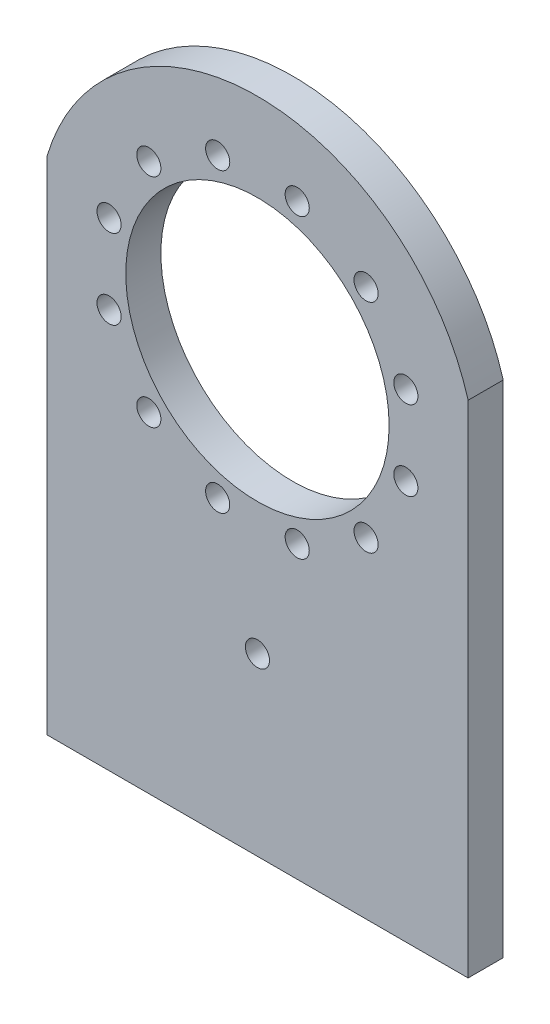
ISO-10303-21;
HEADER;
FILE_DESCRIPTION(('STEP AP214'),'2;1');
FILE_NAME('part.step','',(''),(''),'','','');
FILE_SCHEMA(('AUTOMOTIVE_DESIGN { 1 0 10303 214 1 1 1 1 }'));
ENDSEC;
DATA;
#1=APPLICATION_CONTEXT('core data for automotive mechanical design processes');
#2=APPLICATION_PROTOCOL_DEFINITION('international standard','automotive_design',2000,#1);
#3=PRODUCT_CONTEXT('',#1,'mechanical');
#4=PRODUCT('Part','Part','',(#3));
#5=PRODUCT_RELATED_PRODUCT_CATEGORY('part','',(#4));
#6=PRODUCT_DEFINITION_FORMATION('','',#4);
#7=PRODUCT_DEFINITION_CONTEXT('part definition',#1,'design');
#8=PRODUCT_DEFINITION('design','',#6,#7);
#9=PRODUCT_DEFINITION_SHAPE('','',#8);
#10=(LENGTH_UNIT() NAMED_UNIT(*) SI_UNIT(.MILLI.,.METRE.));
#11=(NAMED_UNIT(*) PLANE_ANGLE_UNIT() SI_UNIT($,.RADIAN.));
#12=(NAMED_UNIT(*) SI_UNIT($,.STERADIAN.) SOLID_ANGLE_UNIT());
#13=UNCERTAINTY_MEASURE_WITH_UNIT(LENGTH_MEASURE(1.E-05),#10,'distance_accuracy_value','');
#14=(GEOMETRIC_REPRESENTATION_CONTEXT(3) GLOBAL_UNCERTAINTY_ASSIGNED_CONTEXT((#13)) GLOBAL_UNIT_ASSIGNED_CONTEXT((#10,
#11,#12)) REPRESENTATION_CONTEXT('',''));
#15=CARTESIAN_POINT('',(0.,0.,0.));
#16=DIRECTION('',(0.,0.,1.));
#17=DIRECTION('',(1.,0.,0.));
#18=AXIS2_PLACEMENT_3D('',#15,#16,#17);
#19=CARTESIAN_POINT('',(0.,100.,8.));
#20=DIRECTION('',(0.,0.,1.));
#21=DIRECTION('',(1.,0.,0.));
#22=AXIS2_PLACEMENT_3D('',#19,#20,#21);
#23=PLANE('',#22);
#24=CARTESIAN_POINT('',(24.7487373415295,124.74873734153,8.));
#25=DIRECTION('',(0.,0.,1.));
#26=DIRECTION('',(1.,0.,0.));
#27=AXIS2_PLACEMENT_3D('',#24,#25,#26);
#28=CIRCLE('',#27,2.75);
#29=CARTESIAN_POINT('',(27.4987373415295,124.74873734153,8.));
#30=VERTEX_POINT('',#29);
#31=EDGE_CURVE('E424',#30,#30,#28,.T.);
#32=ORIENTED_EDGE('',*,*,#31,.F.);
#33=EDGE_LOOP('',(#32));
#34=FACE_BOUND('',#33,.T.);
#35=CARTESIAN_POINT('',(33.8074039201181,109.058666578589,8.));
#36=DIRECTION('',(0.,0.,1.));
#37=DIRECTION('',(1.,0.,0.));
#38=AXIS2_PLACEMENT_3D('',#35,#36,#37);
#39=CIRCLE('',#38,2.75);
#40=CARTESIAN_POINT('',(36.5574039201181,109.058666578589,8.));
#41=VERTEX_POINT('',#40);
#42=EDGE_CURVE('E425',#41,#41,#39,.T.);
#43=ORIENTED_EDGE('',*,*,#42,.F.);
#44=EDGE_LOOP('',(#43));
#45=FACE_BOUND('',#44,.T.);
#46=CARTESIAN_POINT('',(33.8074039201186,90.9413334214123,8.));
#47=DIRECTION('',(0.,0.,1.));
#48=DIRECTION('',(1.,0.,0.));
#49=AXIS2_PLACEMENT_3D('',#46,#47,#48);
#50=CIRCLE('',#49,2.75);
#51=CARTESIAN_POINT('',(36.5574039201186,90.9413334214123,8.));
#52=VERTEX_POINT('',#51);
#53=EDGE_CURVE('E429',#52,#52,#50,.T.);
#54=ORIENTED_EDGE('',*,*,#53,.F.);
#55=EDGE_LOOP('',(#54));
#56=FACE_BOUND('',#55,.T.);
#57=CARTESIAN_POINT('',(24.7487373415307,75.2512626584711,8.));
#58=DIRECTION('',(0.,0.,1.));
#59=DIRECTION('',(1.,0.,0.));
#60=AXIS2_PLACEMENT_3D('',#57,#58,#59);
#61=CIRCLE('',#60,2.74999999999999);
#62=CARTESIAN_POINT('',(27.4987373415307,75.2512626584711,8.));
#63=VERTEX_POINT('',#62);
#64=EDGE_CURVE('E437',#63,#63,#61,.T.);
#65=ORIENTED_EDGE('',*,*,#64,.F.);
#66=EDGE_LOOP('',(#65));
#67=FACE_BOUND('',#66,.T.);
#68=CARTESIAN_POINT('',(9.05866657858986,66.1925960798825,8.));
#69=DIRECTION('',(0.,0.,1.));
#70=DIRECTION('',(1.,0.,0.));
#71=AXIS2_PLACEMENT_3D('',#68,#69,#70);
#72=CIRCLE('',#71,2.74999999999999);
#73=CARTESIAN_POINT('',(11.8086665785899,66.1925960798825,8.));
#74=VERTEX_POINT('',#73);
#75=EDGE_CURVE('E440',#74,#74,#72,.T.);
#76=ORIENTED_EDGE('',*,*,#75,.F.);
#77=EDGE_LOOP('',(#76));
#78=FACE_BOUND('',#77,.T.);
#79=CARTESIAN_POINT('',(-9.05866657858664,66.1925960798821,8.));
#80=DIRECTION('',(0.,0.,1.));
#81=DIRECTION('',(1.,0.,0.));
#82=AXIS2_PLACEMENT_3D('',#79,#80,#81);
#83=CIRCLE('',#82,2.75);
#84=CARTESIAN_POINT('',(-6.30866657858664,66.1925960798821,8.));
#85=VERTEX_POINT('',#84);
#86=EDGE_CURVE('E443',#85,#85,#83,.T.);
#87=ORIENTED_EDGE('',*,*,#86,.F.);
#88=EDGE_LOOP('',(#87));
#89=FACE_BOUND('',#88,.T.);
#90=CARTESIAN_POINT('',(-24.7487373415278,75.2512626584701,8.));
#91=DIRECTION('',(0.,0.,1.));
#92=DIRECTION('',(1.,0.,0.));
#93=AXIS2_PLACEMENT_3D('',#90,#91,#92);
#94=CIRCLE('',#93,2.75);
#95=CARTESIAN_POINT('',(-21.9987373415278,75.2512626584701,8.));
#96=VERTEX_POINT('',#95);
#97=EDGE_CURVE('E446',#96,#96,#94,.T.);
#98=ORIENTED_EDGE('',*,*,#97,.F.);
#99=EDGE_LOOP('',(#98));
#100=FACE_BOUND('',#99,.T.);
#101=CARTESIAN_POINT('',(-33.8074039201163,90.9413334214109,8.));
#102=DIRECTION('',(0.,0.,1.));
#103=DIRECTION('',(1.,0.,0.));
#104=AXIS2_PLACEMENT_3D('',#101,#102,#103);
#105=CIRCLE('',#104,2.74999999999999);
#106=CARTESIAN_POINT('',(-31.0574039201164,90.9413334214109,8.));
#107=VERTEX_POINT('',#106);
#108=EDGE_CURVE('E448',#107,#107,#105,.T.);
#109=ORIENTED_EDGE('',*,*,#108,.F.);
#110=EDGE_LOOP('',(#109));
#111=FACE_BOUND('',#110,.T.);
#112=CARTESIAN_POINT('',(-33.8074039201166,109.058666578587,8.));
#113=DIRECTION('',(0.,0.,1.));
#114=DIRECTION('',(1.,0.,0.));
#115=AXIS2_PLACEMENT_3D('',#112,#113,#114);
#116=CIRCLE('',#115,2.75);
#117=CARTESIAN_POINT('',(-31.0574039201166,109.058666578587,8.));
#118=VERTEX_POINT('',#117);
#119=EDGE_CURVE('E450',#118,#118,#116,.T.);
#120=ORIENTED_EDGE('',*,*,#119,.F.);
#121=EDGE_LOOP('',(#120));
#122=FACE_BOUND('',#121,.T.);
#123=CARTESIAN_POINT('',(-24.7487373415286,124.748737341529,8.));
#124=DIRECTION('',(0.,0.,1.));
#125=DIRECTION('',(1.,0.,0.));
#126=AXIS2_PLACEMENT_3D('',#123,#124,#125);
#127=CIRCLE('',#126,2.74999999999999);
#128=CARTESIAN_POINT('',(-21.9987373415286,124.748737341529,8.));
#129=VERTEX_POINT('',#128);
#130=EDGE_CURVE('E453',#129,#129,#127,.T.);
#131=ORIENTED_EDGE('',*,*,#130,.F.);
#132=EDGE_LOOP('',(#131));
#133=FACE_BOUND('',#132,.T.);
#134=CARTESIAN_POINT('',(-9.05866657858777,133.807403920117,8.));
#135=DIRECTION('',(0.,0.,1.));
#136=DIRECTION('',(1.,0.,0.));
#137=AXIS2_PLACEMENT_3D('',#134,#135,#136);
#138=CIRCLE('',#137,2.75);
#139=CARTESIAN_POINT('',(-6.30866657858776,133.807403920117,8.));
#140=VERTEX_POINT('',#139);
#141=EDGE_CURVE('E432',#140,#140,#138,.T.);
#142=ORIENTED_EDGE('',*,*,#141,.F.);
#143=EDGE_LOOP('',(#142));
#144=FACE_BOUND('',#143,.T.);
#145=CARTESIAN_POINT('',(9.05866657858826,133.807403920117,8.));
#146=DIRECTION('',(0.,0.,1.));
#147=DIRECTION('',(1.,0.,0.));
#148=AXIS2_PLACEMENT_3D('',#145,#146,#147);
#149=CIRCLE('',#148,2.75);
#150=CARTESIAN_POINT('',(11.8086665785883,133.807403920117,8.));
#151=VERTEX_POINT('',#150);
#152=EDGE_CURVE('E120',#151,#151,#149,.T.);
#153=ORIENTED_EDGE('',*,*,#152,.F.);
#154=EDGE_LOOP('',(#153));
#155=FACE_BOUND('',#154,.T.);
#156=CARTESIAN_POINT('',(0.,40.,8.));
#157=DIRECTION('',(0.,0.,1.));
#158=DIRECTION('',(1.,0.,0.));
#159=AXIS2_PLACEMENT_3D('',#156,#157,#158);
#160=CIRCLE('',#159,2.75);
#161=CARTESIAN_POINT('',(2.75,40.,8.));
#162=VERTEX_POINT('',#161);
#163=EDGE_CURVE('E115',#162,#162,#160,.T.);
#164=ORIENTED_EDGE('',*,*,#163,.F.);
#165=EDGE_LOOP('',(#164));
#166=FACE_BOUND('',#165,.T.);
#167=DIRECTION('',(0.,1.,0.));
#168=VECTOR('',#167,1.);
#169=CARTESIAN_POINT('',(48.,114.,8.));
#170=LINE('',#169,#168);
#171=CARTESIAN_POINT('',(48.,0.,8.));
#172=VERTEX_POINT('',#171);
#173=CARTESIAN_POINT('',(48.,114.,8.));
#174=VERTEX_POINT('',#173);
#175=EDGE_CURVE('E89',#172,#174,#170,.T.);
#176=ORIENTED_EDGE('',*,*,#175,.T.);
#177=CARTESIAN_POINT('',(0.,100.,8.));
#178=DIRECTION('',(0.,0.,1.));
#179=DIRECTION('',(1.,0.,0.));
#180=AXIS2_PLACEMENT_3D('',#177,#178,#179);
#181=CIRCLE('',#180,50.);
#182=CARTESIAN_POINT('',(-48.,114.,8.));
#183=VERTEX_POINT('',#182);
#184=EDGE_CURVE('E84',#174,#183,#181,.T.);
#185=ORIENTED_EDGE('',*,*,#184,.T.);
#186=DIRECTION('',(0.,-1.,0.));
#187=VECTOR('',#186,1.);
#188=CARTESIAN_POINT('',(-48.,114.,8.));
#189=LINE('',#188,#187);
#190=CARTESIAN_POINT('',(-48.,0.,8.));
#191=VERTEX_POINT('',#190);
#192=EDGE_CURVE('E87',#183,#191,#189,.T.);
#193=ORIENTED_EDGE('',*,*,#192,.T.);
#194=DIRECTION('',(1.,0.,0.));
#195=VECTOR('',#194,1.);
#196=CARTESIAN_POINT('',(-48.,0.,8.));
#197=LINE('',#196,#195);
#198=EDGE_CURVE('E54',#191,#172,#197,.T.);
#199=ORIENTED_EDGE('',*,*,#198,.T.);
#200=EDGE_LOOP('',(#176,#185,#193,#199));
#201=FACE_BOUND('',#200,.T.);
#202=CARTESIAN_POINT('',(0.,100.,8.));
#203=DIRECTION('',(0.,0.,1.));
#204=DIRECTION('',(1.,0.,0.));
#205=AXIS2_PLACEMENT_3D('',#202,#203,#204);
#206=CIRCLE('',#205,30.);
#207=CARTESIAN_POINT('',(30.,100.,8.));
#208=VERTEX_POINT('',#207);
#209=EDGE_CURVE('E105',#208,#208,#206,.T.);
#210=ORIENTED_EDGE('',*,*,#209,.F.);
#211=EDGE_LOOP('',(#210));
#212=FACE_BOUND('',#211,.T.);
#213=ADVANCED_FACE('F35',(#34,#45,#56,#67,#78,#89,#100,#111,#122,#133,#144,#155,#166,#201,#212),
#23,.T.);
#214=CARTESIAN_POINT('',(0.,100.,0.));
#215=DIRECTION('',(0.,0.,1.));
#216=DIRECTION('',(1.,0.,0.));
#217=AXIS2_PLACEMENT_3D('',#214,#215,#216);
#218=PLANE('',#217);
#219=CARTESIAN_POINT('',(24.7487373415295,124.74873734153,0.));
#220=DIRECTION('',(0.,0.,1.));
#221=DIRECTION('',(1.,0.,0.));
#222=AXIS2_PLACEMENT_3D('',#219,#220,#221);
#223=CIRCLE('',#222,2.75);
#224=CARTESIAN_POINT('',(27.4987373415295,124.74873734153,0.));
#225=VERTEX_POINT('',#224);
#226=EDGE_CURVE('E39',#225,#225,#223,.T.);
#227=ORIENTED_EDGE('',*,*,#226,.T.);
#228=EDGE_LOOP('',(#227));
#229=FACE_BOUND('',#228,.T.);
#230=CARTESIAN_POINT('',(33.8074039201181,109.058666578589,0.));
#231=DIRECTION('',(0.,0.,1.));
#232=DIRECTION('',(1.,0.,0.));
#233=AXIS2_PLACEMENT_3D('',#230,#231,#232);
#234=CIRCLE('',#233,2.75);
#235=CARTESIAN_POINT('',(36.5574039201181,109.058666578589,0.));
#236=VERTEX_POINT('',#235);
#237=EDGE_CURVE('E146',#236,#236,#234,.T.);
#238=ORIENTED_EDGE('',*,*,#237,.T.);
#239=EDGE_LOOP('',(#238));
#240=FACE_BOUND('',#239,.T.);
#241=CARTESIAN_POINT('',(33.8074039201186,90.9413334214123,0.));
#242=DIRECTION('',(0.,0.,1.));
#243=DIRECTION('',(1.,0.,0.));
#244=AXIS2_PLACEMENT_3D('',#241,#242,#243);
#245=CIRCLE('',#244,2.75);
#246=CARTESIAN_POINT('',(36.5574039201186,90.9413334214123,0.));
#247=VERTEX_POINT('',#246);
#248=EDGE_CURVE('E144',#247,#247,#245,.T.);
#249=ORIENTED_EDGE('',*,*,#248,.T.);
#250=EDGE_LOOP('',(#249));
#251=FACE_BOUND('',#250,.T.);
#252=CARTESIAN_POINT('',(24.7487373415307,75.2512626584711,0.));
#253=DIRECTION('',(0.,0.,1.));
#254=DIRECTION('',(1.,0.,0.));
#255=AXIS2_PLACEMENT_3D('',#252,#253,#254);
#256=CIRCLE('',#255,2.74999999999999);
#257=CARTESIAN_POINT('',(27.4987373415307,75.2512626584711,0.));
#258=VERTEX_POINT('',#257);
#259=EDGE_CURVE('E141',#258,#258,#256,.T.);
#260=ORIENTED_EDGE('',*,*,#259,.T.);
#261=EDGE_LOOP('',(#260));
#262=FACE_BOUND('',#261,.T.);
#263=CARTESIAN_POINT('',(9.05866657858986,66.1925960798825,0.));
#264=DIRECTION('',(0.,0.,1.));
#265=DIRECTION('',(1.,0.,0.));
#266=AXIS2_PLACEMENT_3D('',#263,#264,#265);
#267=CIRCLE('',#266,2.74999999999999);
#268=CARTESIAN_POINT('',(11.8086665785899,66.1925960798825,0.));
#269=VERTEX_POINT('',#268);
#270=EDGE_CURVE('E138',#269,#269,#267,.T.);
#271=ORIENTED_EDGE('',*,*,#270,.T.);
#272=EDGE_LOOP('',(#271));
#273=FACE_BOUND('',#272,.T.);
#274=CARTESIAN_POINT('',(-9.05866657858664,66.1925960798821,0.));
#275=DIRECTION('',(0.,0.,1.));
#276=DIRECTION('',(1.,0.,0.));
#277=AXIS2_PLACEMENT_3D('',#274,#275,#276);
#278=CIRCLE('',#277,2.75);
#279=CARTESIAN_POINT('',(-6.30866657858664,66.1925960798821,0.));
#280=VERTEX_POINT('',#279);
#281=EDGE_CURVE('E135',#280,#280,#278,.T.);
#282=ORIENTED_EDGE('',*,*,#281,.T.);
#283=EDGE_LOOP('',(#282));
#284=FACE_BOUND('',#283,.T.);
#285=CARTESIAN_POINT('',(-24.7487373415278,75.2512626584701,0.));
#286=DIRECTION('',(0.,0.,1.));
#287=DIRECTION('',(1.,0.,0.));
#288=AXIS2_PLACEMENT_3D('',#285,#286,#287);
#289=CIRCLE('',#288,2.75);
#290=CARTESIAN_POINT('',(-21.9987373415278,75.2512626584701,0.));
#291=VERTEX_POINT('',#290);
#292=EDGE_CURVE('E132',#291,#291,#289,.T.);
#293=ORIENTED_EDGE('',*,*,#292,.T.);
#294=EDGE_LOOP('',(#293));
#295=FACE_BOUND('',#294,.T.);
#296=CARTESIAN_POINT('',(-33.8074039201163,90.9413334214109,0.));
#297=DIRECTION('',(0.,0.,1.));
#298=DIRECTION('',(1.,0.,0.));
#299=AXIS2_PLACEMENT_3D('',#296,#297,#298);
#300=CIRCLE('',#299,2.74999999999999);
#301=CARTESIAN_POINT('',(-31.0574039201164,90.9413334214109,0.));
#302=VERTEX_POINT('',#301);
#303=EDGE_CURVE('E129',#302,#302,#300,.T.);
#304=ORIENTED_EDGE('',*,*,#303,.T.);
#305=EDGE_LOOP('',(#304));
#306=FACE_BOUND('',#305,.T.);
#307=CARTESIAN_POINT('',(-33.8074039201166,109.058666578587,0.));
#308=DIRECTION('',(0.,0.,1.));
#309=DIRECTION('',(1.,0.,0.));
#310=AXIS2_PLACEMENT_3D('',#307,#308,#309);
#311=CIRCLE('',#310,2.75);
#312=CARTESIAN_POINT('',(-31.0574039201166,109.058666578587,0.));
#313=VERTEX_POINT('',#312);
#314=EDGE_CURVE('E126',#313,#313,#311,.T.);
#315=ORIENTED_EDGE('',*,*,#314,.T.);
#316=EDGE_LOOP('',(#315));
#317=FACE_BOUND('',#316,.T.);
#318=CARTESIAN_POINT('',(-24.7487373415286,124.748737341529,0.));
#319=DIRECTION('',(0.,0.,1.));
#320=DIRECTION('',(1.,0.,0.));
#321=AXIS2_PLACEMENT_3D('',#318,#319,#320);
#322=CIRCLE('',#321,2.74999999999999);
#323=CARTESIAN_POINT('',(-21.9987373415286,124.748737341529,0.));
#324=VERTEX_POINT('',#323);
#325=EDGE_CURVE('E123',#324,#324,#322,.T.);
#326=ORIENTED_EDGE('',*,*,#325,.T.);
#327=EDGE_LOOP('',(#326));
#328=FACE_BOUND('',#327,.T.);
#329=CARTESIAN_POINT('',(-9.05866657858777,133.807403920117,0.));
#330=DIRECTION('',(0.,0.,1.));
#331=DIRECTION('',(1.,0.,0.));
#332=AXIS2_PLACEMENT_3D('',#329,#330,#331);
#333=CIRCLE('',#332,2.75);
#334=CARTESIAN_POINT('',(-6.30866657858776,133.807403920117,0.));
#335=VERTEX_POINT('',#334);
#336=EDGE_CURVE('E119',#335,#335,#333,.T.);
#337=ORIENTED_EDGE('',*,*,#336,.T.);
#338=EDGE_LOOP('',(#337));
#339=FACE_BOUND('',#338,.T.);
#340=CARTESIAN_POINT('',(9.05866657858826,133.807403920117,0.));
#341=DIRECTION('',(0.,0.,1.));
#342=DIRECTION('',(1.,0.,0.));
#343=AXIS2_PLACEMENT_3D('',#340,#341,#342);
#344=CIRCLE('',#343,2.75);
#345=CARTESIAN_POINT('',(11.8086665785883,133.807403920117,0.));
#346=VERTEX_POINT('',#345);
#347=EDGE_CURVE('E116',#346,#346,#344,.T.);
#348=ORIENTED_EDGE('',*,*,#347,.T.);
#349=EDGE_LOOP('',(#348));
#350=FACE_BOUND('',#349,.T.);
#351=CARTESIAN_POINT('',(0.,40.,0.));
#352=DIRECTION('',(0.,0.,1.));
#353=DIRECTION('',(1.,0.,0.));
#354=AXIS2_PLACEMENT_3D('',#351,#352,#353);
#355=CIRCLE('',#354,2.75);
#356=CARTESIAN_POINT('',(2.75,40.,0.));
#357=VERTEX_POINT('',#356);
#358=EDGE_CURVE('E111',#357,#357,#355,.T.);
#359=ORIENTED_EDGE('',*,*,#358,.T.);
#360=EDGE_LOOP('',(#359));
#361=FACE_BOUND('',#360,.T.);
#362=DIRECTION('',(0.,1.,0.));
#363=VECTOR('',#362,1.);
#364=CARTESIAN_POINT('',(48.,114.,0.));
#365=LINE('',#364,#363);
#366=CARTESIAN_POINT('',(48.,0.,0.));
#367=VERTEX_POINT('',#366);
#368=CARTESIAN_POINT('',(48.,114.,0.));
#369=VERTEX_POINT('',#368);
#370=EDGE_CURVE('E102',#367,#369,#365,.T.);
#371=ORIENTED_EDGE('',*,*,#370,.F.);
#372=DIRECTION('',(1.,0.,0.));
#373=VECTOR('',#372,1.);
#374=CARTESIAN_POINT('',(-48.,0.,0.));
#375=LINE('',#374,#373);
#376=CARTESIAN_POINT('',(-48.,0.,0.));
#377=VERTEX_POINT('',#376);
#378=EDGE_CURVE('E77',#377,#367,#375,.T.);
#379=ORIENTED_EDGE('',*,*,#378,.F.);
#380=DIRECTION('',(0.,-1.,0.));
#381=VECTOR('',#380,1.);
#382=CARTESIAN_POINT('',(-48.,114.,0.));
#383=LINE('',#382,#381);
#384=CARTESIAN_POINT('',(-48.,114.,0.));
#385=VERTEX_POINT('',#384);
#386=EDGE_CURVE('E71',#385,#377,#383,.T.);
#387=ORIENTED_EDGE('',*,*,#386,.F.);
#388=CARTESIAN_POINT('',(0.,100.,0.));
#389=DIRECTION('',(0.,0.,1.));
#390=DIRECTION('',(1.,0.,0.));
#391=AXIS2_PLACEMENT_3D('',#388,#389,#390);
#392=CIRCLE('',#391,50.);
#393=EDGE_CURVE('E93',#369,#385,#392,.T.);
#394=ORIENTED_EDGE('',*,*,#393,.F.);
#395=EDGE_LOOP('',(#371,#379,#387,#394));
#396=FACE_BOUND('',#395,.T.);
#397=CARTESIAN_POINT('',(0.,100.,0.));
#398=DIRECTION('',(0.,0.,1.));
#399=DIRECTION('',(1.,0.,0.));
#400=AXIS2_PLACEMENT_3D('',#397,#398,#399);
#401=CIRCLE('',#400,30.);
#402=CARTESIAN_POINT('',(30.,100.,0.));
#403=VERTEX_POINT('',#402);
#404=EDGE_CURVE('E163',#403,#403,#401,.T.);
#405=ORIENTED_EDGE('',*,*,#404,.T.);
#406=EDGE_LOOP('',(#405));
#407=FACE_BOUND('',#406,.T.);
#408=ADVANCED_FACE('F177',(#229,#240,#251,#262,#273,#284,#295,#306,#317,#328,#339,#350,#361,
#396,#407),#218,.F.);
#409=CARTESIAN_POINT('',(48.,114.,8.));
#410=DIRECTION('',(-1.,0.,0.));
#411=DIRECTION('',(0.,-1.,0.));
#412=AXIS2_PLACEMENT_3D('',#409,#410,#411);
#413=PLANE('',#412);
#414=ORIENTED_EDGE('',*,*,#370,.T.);
#415=DIRECTION('',(0.,0.,-1.));
#416=VECTOR('',#415,1.);
#417=CARTESIAN_POINT('',(48.,114.,8.));
#418=LINE('',#417,#416);
#419=EDGE_CURVE('E11',#174,#369,#418,.T.);
#420=ORIENTED_EDGE('',*,*,#419,.F.);
#421=ORIENTED_EDGE('',*,*,#175,.F.);
#422=DIRECTION('',(0.,0.,-1.));
#423=VECTOR('',#422,1.);
#424=CARTESIAN_POINT('',(48.,0.,8.));
#425=LINE('',#424,#423);
#426=EDGE_CURVE('E98',#172,#367,#425,.T.);
#427=ORIENTED_EDGE('',*,*,#426,.T.);
#428=EDGE_LOOP('',(#414,#420,#421,#427));
#429=FACE_BOUND('',#428,.T.);
#430=ADVANCED_FACE('F37',(#429),#413,.F.);
#431=CARTESIAN_POINT('',(0.,100.,8.));
#432=DIRECTION('',(0.,0.,-1.));
#433=DIRECTION('',(-1.,0.,0.));
#434=AXIS2_PLACEMENT_3D('',#431,#432,#433);
#435=CYLINDRICAL_SURFACE('',#434,50.);
#436=ORIENTED_EDGE('',*,*,#393,.T.);
#437=DIRECTION('',(0.,0.,-1.));
#438=VECTOR('',#437,1.);
#439=CARTESIAN_POINT('',(-48.,114.,8.));
#440=LINE('',#439,#438);
#441=EDGE_CURVE('E45',#183,#385,#440,.T.);
#442=ORIENTED_EDGE('',*,*,#441,.F.);
#443=ORIENTED_EDGE('',*,*,#184,.F.);
#444=ORIENTED_EDGE('',*,*,#419,.T.);
#445=EDGE_LOOP('',(#436,#442,#443,#444));
#446=FACE_BOUND('',#445,.T.);
#447=ADVANCED_FACE('F92',(#446),#435,.T.);
#448=CARTESIAN_POINT('',(-48.,114.,8.));
#449=DIRECTION('',(1.,0.,0.));
#450=DIRECTION('',(0.,1.,0.));
#451=AXIS2_PLACEMENT_3D('',#448,#449,#450);
#452=PLANE('',#451);
#453=ORIENTED_EDGE('',*,*,#386,.T.);
#454=DIRECTION('',(0.,0.,-1.));
#455=VECTOR('',#454,1.);
#456=CARTESIAN_POINT('',(-48.,0.,8.));
#457=LINE('',#456,#455);
#458=EDGE_CURVE('E94',#191,#377,#457,.T.);
#459=ORIENTED_EDGE('',*,*,#458,.F.);
#460=ORIENTED_EDGE('',*,*,#192,.F.);
#461=ORIENTED_EDGE('',*,*,#441,.T.);
#462=EDGE_LOOP('',(#453,#459,#460,#461));
#463=FACE_BOUND('',#462,.T.);
#464=ADVANCED_FACE('F96',(#463),#452,.F.);
#465=CARTESIAN_POINT('',(-48.,0.,8.));
#466=DIRECTION('',(0.,1.,0.));
#467=DIRECTION('',(0.,0.,1.));
#468=AXIS2_PLACEMENT_3D('',#465,#466,#467);
#469=PLANE('',#468);
#470=CARTESIAN_POINT('',(35.,0.,4.00000000000001));
#471=DIRECTION('',(0.,-1.,0.));
#472=DIRECTION('',(0.,0.,-1.));
#473=AXIS2_PLACEMENT_3D('',#470,#471,#472);
#474=CIRCLE('',#473,2.75);
#475=CARTESIAN_POINT('',(35.,0.,1.25000000000001));
#476=VERTEX_POINT('',#475);
#477=EDGE_CURVE('E164',#476,#476,#474,.T.);
#478=ORIENTED_EDGE('',*,*,#477,.F.);
#479=EDGE_LOOP('',(#478));
#480=FACE_BOUND('',#479,.T.);
#481=CARTESIAN_POINT('',(-35.,0.,4.));
#482=DIRECTION('',(0.,-1.,0.));
#483=DIRECTION('',(0.,0.,-1.));
#484=AXIS2_PLACEMENT_3D('',#481,#482,#483);
#485=CIRCLE('',#484,2.75);
#486=CARTESIAN_POINT('',(-35.,0.,1.25));
#487=VERTEX_POINT('',#486);
#488=EDGE_CURVE('E114',#487,#487,#485,.T.);
#489=ORIENTED_EDGE('',*,*,#488,.F.);
#490=EDGE_LOOP('',(#489));
#491=FACE_BOUND('',#490,.T.);
#492=ORIENTED_EDGE('',*,*,#378,.T.);
#493=ORIENTED_EDGE('',*,*,#426,.F.);
#494=ORIENTED_EDGE('',*,*,#198,.F.);
#495=ORIENTED_EDGE('',*,*,#458,.T.);
#496=EDGE_LOOP('',(#492,#493,#494,#495));
#497=FACE_BOUND('',#496,.T.);
#498=ADVANCED_FACE('F182',(#480,#491,#497),#469,.F.);
#499=CARTESIAN_POINT('',(0.,100.,8.));
#500=DIRECTION('',(0.,0.,-1.));
#501=DIRECTION('',(-1.,0.,0.));
#502=AXIS2_PLACEMENT_3D('',#499,#500,#501);
#503=CYLINDRICAL_SURFACE('',#502,30.);
#504=ORIENTED_EDGE('',*,*,#209,.T.);
#505=EDGE_LOOP('',(#504));
#506=FACE_BOUND('',#505,.T.);
#507=ORIENTED_EDGE('',*,*,#404,.F.);
#508=EDGE_LOOP('',(#507));
#509=FACE_BOUND('',#508,.T.);
#510=ADVANCED_FACE('F179',(#506,#509),#503,.F.);
#511=CARTESIAN_POINT('',(-35.,50.,4.));
#512=DIRECTION('',(0.,-1.,0.));
#513=DIRECTION('',(0.,0.,-1.));
#514=AXIS2_PLACEMENT_3D('',#511,#512,#513);
#515=CYLINDRICAL_SURFACE('',#514,2.75);
#516=CARTESIAN_POINT('',(-35.,50.,4.));
#517=DIRECTION('',(0.,-1.,0.));
#518=DIRECTION('',(0.,0.,-1.));
#519=AXIS2_PLACEMENT_3D('',#516,#517,#518);
#520=CIRCLE('',#519,2.75);
#521=CARTESIAN_POINT('',(-35.,50.,1.25));
#522=VERTEX_POINT('',#521);
#523=EDGE_CURVE('E167',#522,#522,#520,.T.);
#524=ORIENTED_EDGE('',*,*,#523,.F.);
#525=EDGE_LOOP('',(#524));
#526=FACE_BOUND('',#525,.T.);
#527=ORIENTED_EDGE('',*,*,#488,.T.);
#528=EDGE_LOOP('',(#527));
#529=FACE_BOUND('',#528,.T.);
#530=ADVANCED_FACE('F181',(#526,#529),#515,.F.);
#531=CARTESIAN_POINT('',(-35.,50.,4.));
#532=DIRECTION('',(0.,-1.,0.));
#533=DIRECTION('',(0.,0.,-1.));
#534=AXIS2_PLACEMENT_3D('',#531,#532,#533);
#535=PLANE('',#534);
#536=ORIENTED_EDGE('',*,*,#523,.T.);
#537=EDGE_LOOP('',(#536));
#538=FACE_BOUND('',#537,.T.);
#539=ADVANCED_FACE('F189',(#538),#535,.T.);
#540=CARTESIAN_POINT('',(35.,50.,4.00000000000001));
#541=DIRECTION('',(0.,-1.,0.));
#542=DIRECTION('',(0.,0.,-1.));
#543=AXIS2_PLACEMENT_3D('',#540,#541,#542);
#544=CYLINDRICAL_SURFACE('',#543,2.75);
#545=CARTESIAN_POINT('',(35.,50.,4.00000000000001));
#546=DIRECTION('',(0.,-1.,0.));
#547=DIRECTION('',(0.,0.,-1.));
#548=AXIS2_PLACEMENT_3D('',#545,#546,#547);
#549=CIRCLE('',#548,2.75);
#550=CARTESIAN_POINT('',(35.,50.,1.25000000000001));
#551=VERTEX_POINT('',#550);
#552=EDGE_CURVE('E160',#551,#551,#549,.T.);
#553=ORIENTED_EDGE('',*,*,#552,.F.);
#554=EDGE_LOOP('',(#553));
#555=FACE_BOUND('',#554,.T.);
#556=ORIENTED_EDGE('',*,*,#477,.T.);
#557=EDGE_LOOP('',(#556));
#558=FACE_BOUND('',#557,.T.);
#559=ADVANCED_FACE('F358',(#555,#558),#544,.F.);
#560=CARTESIAN_POINT('',(35.,50.,4.00000000000001));
#561=DIRECTION('',(0.,-1.,0.));
#562=DIRECTION('',(0.,0.,-1.));
#563=AXIS2_PLACEMENT_3D('',#560,#561,#562);
#564=PLANE('',#563);
#565=ORIENTED_EDGE('',*,*,#552,.T.);
#566=EDGE_LOOP('',(#565));
#567=FACE_BOUND('',#566,.T.);
#568=ADVANCED_FACE('F355',(#567),#564,.T.);
#569=CARTESIAN_POINT('',(0.,40.,-12.));
#570=DIRECTION('',(0.,0.,1.));
#571=DIRECTION('',(1.,0.,0.));
#572=AXIS2_PLACEMENT_3D('',#569,#570,#571);
#573=CYLINDRICAL_SURFACE('',#572,2.75);
#574=ORIENTED_EDGE('',*,*,#163,.T.);
#575=EDGE_LOOP('',(#574));
#576=FACE_BOUND('',#575,.T.);
#577=ORIENTED_EDGE('',*,*,#358,.F.);
#578=EDGE_LOOP('',(#577));
#579=FACE_BOUND('',#578,.T.);
#580=ADVANCED_FACE('F235',(#576,#579),#573,.F.);
#581=CARTESIAN_POINT('',(9.05866657858826,133.807403920117,-2.));
#582=DIRECTION('',(0.,0.,1.));
#583=DIRECTION('',(1.,0.,0.));
#584=AXIS2_PLACEMENT_3D('',#581,#582,#583);
#585=CYLINDRICAL_SURFACE('',#584,2.75);
#586=ORIENTED_EDGE('',*,*,#152,.T.);
#587=EDGE_LOOP('',(#586));
#588=FACE_BOUND('',#587,.T.);
#589=ORIENTED_EDGE('',*,*,#347,.F.);
#590=EDGE_LOOP('',(#589));
#591=FACE_BOUND('',#590,.T.);
#592=ADVANCED_FACE('F229',(#588,#591),#585,.F.);
#593=CARTESIAN_POINT('',(-9.05866657858777,133.807403920117,-2.));
#594=DIRECTION('',(0.,0.,1.));
#595=DIRECTION('',(1.,0.,0.));
#596=AXIS2_PLACEMENT_3D('',#593,#594,#595);
#597=CYLINDRICAL_SURFACE('',#596,2.75);
#598=ORIENTED_EDGE('',*,*,#141,.T.);
#599=EDGE_LOOP('',(#598));
#600=FACE_BOUND('',#599,.T.);
#601=ORIENTED_EDGE('',*,*,#336,.F.);
#602=EDGE_LOOP('',(#601));
#603=FACE_BOUND('',#602,.T.);
#604=ADVANCED_FACE('F234',(#600,#603),#597,.F.);
#605=CARTESIAN_POINT('',(-24.7487373415286,124.748737341529,-2.));
#606=DIRECTION('',(0.,0.,1.));
#607=DIRECTION('',(1.,0.,0.));
#608=AXIS2_PLACEMENT_3D('',#605,#606,#607);
#609=CYLINDRICAL_SURFACE('',#608,2.74999999999999);
#610=ORIENTED_EDGE('',*,*,#130,.T.);
#611=EDGE_LOOP('',(#610));
#612=FACE_BOUND('',#611,.T.);
#613=ORIENTED_EDGE('',*,*,#325,.F.);
#614=EDGE_LOOP('',(#613));
#615=FACE_BOUND('',#614,.T.);
#616=ADVANCED_FACE('F247',(#612,#615),#609,.F.);
#617=CARTESIAN_POINT('',(-33.8074039201166,109.058666578587,-2.));
#618=DIRECTION('',(0.,0.,1.));
#619=DIRECTION('',(1.,0.,0.));
#620=AXIS2_PLACEMENT_3D('',#617,#618,#619);
#621=CYLINDRICAL_SURFACE('',#620,2.75);
#622=ORIENTED_EDGE('',*,*,#119,.T.);
#623=EDGE_LOOP('',(#622));
#624=FACE_BOUND('',#623,.T.);
#625=ORIENTED_EDGE('',*,*,#314,.F.);
#626=EDGE_LOOP('',(#625));
#627=FACE_BOUND('',#626,.T.);
#628=ADVANCED_FACE('F257',(#624,#627),#621,.F.);
#629=CARTESIAN_POINT('',(-33.8074039201163,90.9413334214109,-2.));
#630=DIRECTION('',(0.,0.,1.));
#631=DIRECTION('',(1.,0.,0.));
#632=AXIS2_PLACEMENT_3D('',#629,#630,#631);
#633=CYLINDRICAL_SURFACE('',#632,2.74999999999999);
#634=ORIENTED_EDGE('',*,*,#108,.T.);
#635=EDGE_LOOP('',(#634));
#636=FACE_BOUND('',#635,.T.);
#637=ORIENTED_EDGE('',*,*,#303,.F.);
#638=EDGE_LOOP('',(#637));
#639=FACE_BOUND('',#638,.T.);
#640=ADVANCED_FACE('F267',(#636,#639),#633,.F.);
#641=CARTESIAN_POINT('',(-24.7487373415278,75.2512626584701,-2.));
#642=DIRECTION('',(0.,0.,1.));
#643=DIRECTION('',(1.,0.,0.));
#644=AXIS2_PLACEMENT_3D('',#641,#642,#643);
#645=CYLINDRICAL_SURFACE('',#644,2.75);
#646=ORIENTED_EDGE('',*,*,#97,.T.);
#647=EDGE_LOOP('',(#646));
#648=FACE_BOUND('',#647,.T.);
#649=ORIENTED_EDGE('',*,*,#292,.F.);
#650=EDGE_LOOP('',(#649));
#651=FACE_BOUND('',#650,.T.);
#652=ADVANCED_FACE('F277',(#648,#651),#645,.F.);
#653=CARTESIAN_POINT('',(-9.05866657858664,66.1925960798821,-2.));
#654=DIRECTION('',(0.,0.,1.));
#655=DIRECTION('',(1.,0.,0.));
#656=AXIS2_PLACEMENT_3D('',#653,#654,#655);
#657=CYLINDRICAL_SURFACE('',#656,2.75);
#658=ORIENTED_EDGE('',*,*,#86,.T.);
#659=EDGE_LOOP('',(#658));
#660=FACE_BOUND('',#659,.T.);
#661=ORIENTED_EDGE('',*,*,#281,.F.);
#662=EDGE_LOOP('',(#661));
#663=FACE_BOUND('',#662,.T.);
#664=ADVANCED_FACE('F287',(#660,#663),#657,.F.);
#665=CARTESIAN_POINT('',(9.05866657858986,66.1925960798825,-2.));
#666=DIRECTION('',(0.,0.,1.));
#667=DIRECTION('',(1.,0.,0.));
#668=AXIS2_PLACEMENT_3D('',#665,#666,#667);
#669=CYLINDRICAL_SURFACE('',#668,2.74999999999999);
#670=ORIENTED_EDGE('',*,*,#75,.T.);
#671=EDGE_LOOP('',(#670));
#672=FACE_BOUND('',#671,.T.);
#673=ORIENTED_EDGE('',*,*,#270,.F.);
#674=EDGE_LOOP('',(#673));
#675=FACE_BOUND('',#674,.T.);
#676=ADVANCED_FACE('F297',(#672,#675),#669,.F.);
#677=CARTESIAN_POINT('',(24.7487373415307,75.2512626584711,-2.));
#678=DIRECTION('',(0.,0.,1.));
#679=DIRECTION('',(1.,0.,0.));
#680=AXIS2_PLACEMENT_3D('',#677,#678,#679);
#681=CYLINDRICAL_SURFACE('',#680,2.74999999999999);
#682=ORIENTED_EDGE('',*,*,#64,.T.);
#683=EDGE_LOOP('',(#682));
#684=FACE_BOUND('',#683,.T.);
#685=ORIENTED_EDGE('',*,*,#259,.F.);
#686=EDGE_LOOP('',(#685));
#687=FACE_BOUND('',#686,.T.);
#688=ADVANCED_FACE('F307',(#684,#687),#681,.F.);
#689=CARTESIAN_POINT('',(33.8074039201186,90.9413334214123,-2.));
#690=DIRECTION('',(0.,0.,1.));
#691=DIRECTION('',(1.,0.,0.));
#692=AXIS2_PLACEMENT_3D('',#689,#690,#691);
#693=CYLINDRICAL_SURFACE('',#692,2.75);
#694=ORIENTED_EDGE('',*,*,#53,.T.);
#695=EDGE_LOOP('',(#694));
#696=FACE_BOUND('',#695,.T.);
#697=ORIENTED_EDGE('',*,*,#248,.F.);
#698=EDGE_LOOP('',(#697));
#699=FACE_BOUND('',#698,.T.);
#700=ADVANCED_FACE('F317',(#696,#699),#693,.F.);
#701=CARTESIAN_POINT('',(33.8074039201181,109.058666578589,-2.));
#702=DIRECTION('',(0.,0.,1.));
#703=DIRECTION('',(1.,0.,0.));
#704=AXIS2_PLACEMENT_3D('',#701,#702,#703);
#705=CYLINDRICAL_SURFACE('',#704,2.75);
#706=ORIENTED_EDGE('',*,*,#42,.T.);
#707=EDGE_LOOP('',(#706));
#708=FACE_BOUND('',#707,.T.);
#709=ORIENTED_EDGE('',*,*,#237,.F.);
#710=EDGE_LOOP('',(#709));
#711=FACE_BOUND('',#710,.T.);
#712=ADVANCED_FACE('F327',(#708,#711),#705,.F.);
#713=CARTESIAN_POINT('',(24.7487373415295,124.74873734153,-2.));
#714=DIRECTION('',(0.,0.,1.));
#715=DIRECTION('',(1.,0.,0.));
#716=AXIS2_PLACEMENT_3D('',#713,#714,#715);
#717=CYLINDRICAL_SURFACE('',#716,2.75);
#718=ORIENTED_EDGE('',*,*,#31,.T.);
#719=EDGE_LOOP('',(#718));
#720=FACE_BOUND('',#719,.T.);
#721=ORIENTED_EDGE('',*,*,#226,.F.);
#722=EDGE_LOOP('',(#721));
#723=FACE_BOUND('',#722,.T.);
#724=ADVANCED_FACE('F337',(#720,#723),#717,.F.);
#725=CLOSED_SHELL('',(#213,#408,#430,#447,#464,#498,#510,#530,#539,#559,#568,#580,#592,#604,
#616,#628,#640,#652,#664,#676,#688,#700,#712,#724));
#726=MANIFOLD_SOLID_BREP('B2',#725);
#727=ADVANCED_BREP_SHAPE_REPRESENTATION('',(#18,#726),#14);
#728=SHAPE_DEFINITION_REPRESENTATION(#9,#727);
ENDSEC;
END-ISO-10303-21;
